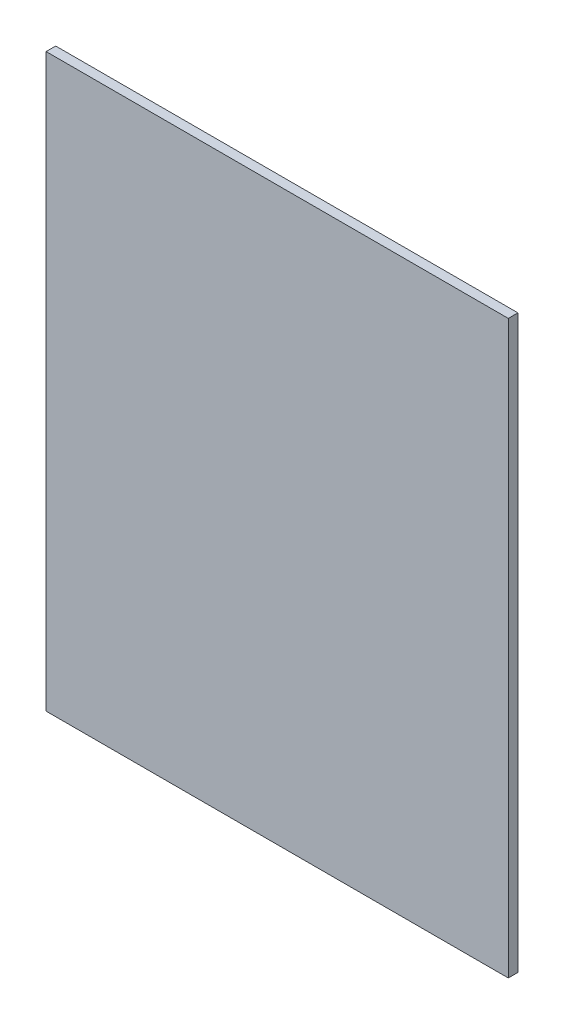
ISO-10303-21;
HEADER;
FILE_DESCRIPTION(('STEP AP214'),'2;1');
FILE_NAME('part.step','',(''),(''),'','','');
FILE_SCHEMA(('AUTOMOTIVE_DESIGN { 1 0 10303 214 1 1 1 1 }'));
ENDSEC;
DATA;
#1=APPLICATION_CONTEXT('core data for automotive mechanical design processes');
#2=APPLICATION_PROTOCOL_DEFINITION('international standard','automotive_design',2000,#1);
#3=PRODUCT_CONTEXT('',#1,'mechanical');
#4=PRODUCT('Part','Part','',(#3));
#5=PRODUCT_RELATED_PRODUCT_CATEGORY('part','',(#4));
#6=PRODUCT_DEFINITION_FORMATION('','',#4);
#7=PRODUCT_DEFINITION_CONTEXT('part definition',#1,'design');
#8=PRODUCT_DEFINITION('design','',#6,#7);
#9=PRODUCT_DEFINITION_SHAPE('','',#8);
#10=(LENGTH_UNIT() NAMED_UNIT(*) SI_UNIT(.MILLI.,.METRE.));
#11=(NAMED_UNIT(*) PLANE_ANGLE_UNIT() SI_UNIT($,.RADIAN.));
#12=(NAMED_UNIT(*) SI_UNIT($,.STERADIAN.) SOLID_ANGLE_UNIT());
#13=UNCERTAINTY_MEASURE_WITH_UNIT(LENGTH_MEASURE(1.E-05),#10,'distance_accuracy_value','');
#14=(GEOMETRIC_REPRESENTATION_CONTEXT(3) GLOBAL_UNCERTAINTY_ASSIGNED_CONTEXT((#13)) GLOBAL_UNIT_ASSIGNED_CONTEXT((#10,
#11,#12)) REPRESENTATION_CONTEXT('',''));
#15=CARTESIAN_POINT('',(0.,0.,0.));
#16=DIRECTION('',(0.,0.,1.));
#17=DIRECTION('',(1.,0.,0.));
#18=AXIS2_PLACEMENT_3D('',#15,#16,#17);
#19=CARTESIAN_POINT('',(438.94375,542.528125,18.25625));
#20=DIRECTION('',(-1.,0.,0.));
#21=DIRECTION('',(0.,-1.,0.));
#22=AXIS2_PLACEMENT_3D('',#19,#20,#21);
#23=PLANE('',#22);
#24=DIRECTION('',(0.,1.,0.));
#25=VECTOR('',#24,1.);
#26=CARTESIAN_POINT('',(438.94375,542.528125,0.));
#27=LINE('',#26,#25);
#28=CARTESIAN_POINT('',(438.94375,-542.528125,0.));
#29=VERTEX_POINT('',#28);
#30=CARTESIAN_POINT('',(438.94375,542.528125,0.));
#31=VERTEX_POINT('',#30);
#32=EDGE_CURVE('E107',#29,#31,#27,.T.);
#33=ORIENTED_EDGE('',*,*,#32,.T.);
#34=DIRECTION('',(0.,0.,-1.));
#35=VECTOR('',#34,1.);
#36=CARTESIAN_POINT('',(438.94375,542.528125,18.25625));
#37=LINE('',#36,#35);
#38=CARTESIAN_POINT('',(438.94375,542.528125,18.25625));
#39=VERTEX_POINT('',#38);
#40=EDGE_CURVE('E11',#39,#31,#37,.T.);
#41=ORIENTED_EDGE('',*,*,#40,.F.);
#42=DIRECTION('',(0.,1.,0.));
#43=VECTOR('',#42,1.);
#44=CARTESIAN_POINT('',(438.94375,542.528125,18.25625));
#45=LINE('',#44,#43);
#46=CARTESIAN_POINT('',(438.94375,-542.528125,18.25625));
#47=VERTEX_POINT('',#46);
#48=EDGE_CURVE('E91',#47,#39,#45,.T.);
#49=ORIENTED_EDGE('',*,*,#48,.F.);
#50=DIRECTION('',(0.,0.,-1.));
#51=VECTOR('',#50,1.);
#52=CARTESIAN_POINT('',(438.94375,-542.528125,18.25625));
#53=LINE('',#52,#51);
#54=EDGE_CURVE('E103',#47,#29,#53,.T.);
#55=ORIENTED_EDGE('',*,*,#54,.T.);
#56=EDGE_LOOP('',(#33,#41,#49,#55));
#57=FACE_BOUND('',#56,.T.);
#58=ADVANCED_FACE('F39',(#57),#23,.F.);
#59=CARTESIAN_POINT('',(-438.94375,542.528125,18.25625));
#60=DIRECTION('',(0.,-1.,0.));
#61=DIRECTION('',(0.,0.,-1.));
#62=AXIS2_PLACEMENT_3D('',#59,#60,#61);
#63=PLANE('',#62);
#64=DIRECTION('',(-1.,0.,0.));
#65=VECTOR('',#64,1.);
#66=CARTESIAN_POINT('',(-438.94375,542.528125,0.));
#67=LINE('',#66,#65);
#68=CARTESIAN_POINT('',(-438.94375,542.528125,0.));
#69=VERTEX_POINT('',#68);
#70=EDGE_CURVE('E96',#31,#69,#67,.T.);
#71=ORIENTED_EDGE('',*,*,#70,.T.);
#72=DIRECTION('',(0.,0.,-1.));
#73=VECTOR('',#72,1.);
#74=CARTESIAN_POINT('',(-438.94375,542.528125,18.25625));
#75=LINE('',#74,#73);
#76=CARTESIAN_POINT('',(-438.94375,542.528125,18.25625));
#77=VERTEX_POINT('',#76);
#78=EDGE_CURVE('E48',#77,#69,#75,.T.);
#79=ORIENTED_EDGE('',*,*,#78,.F.);
#80=DIRECTION('',(-1.,0.,0.));
#81=VECTOR('',#80,1.);
#82=CARTESIAN_POINT('',(-438.94375,542.528125,18.25625));
#83=LINE('',#82,#81);
#84=EDGE_CURVE('E86',#39,#77,#83,.T.);
#85=ORIENTED_EDGE('',*,*,#84,.F.);
#86=ORIENTED_EDGE('',*,*,#40,.T.);
#87=EDGE_LOOP('',(#71,#79,#85,#86));
#88=FACE_BOUND('',#87,.T.);
#89=ADVANCED_FACE('F95',(#88),#63,.F.);
#90=CARTESIAN_POINT('',(-438.94375,542.528125,18.25625));
#91=DIRECTION('',(1.,0.,0.));
#92=DIRECTION('',(0.,1.,0.));
#93=AXIS2_PLACEMENT_3D('',#90,#91,#92);
#94=PLANE('',#93);
#95=DIRECTION('',(0.,-1.,0.));
#96=VECTOR('',#95,1.);
#97=CARTESIAN_POINT('',(-438.94375,542.528125,0.));
#98=LINE('',#97,#96);
#99=CARTESIAN_POINT('',(-438.94375,-542.528125,0.));
#100=VERTEX_POINT('',#99);
#101=EDGE_CURVE('E73',#69,#100,#98,.T.);
#102=ORIENTED_EDGE('',*,*,#101,.T.);
#103=DIRECTION('',(0.,0.,-1.));
#104=VECTOR('',#103,1.);
#105=CARTESIAN_POINT('',(-438.94375,-542.528125,18.25625));
#106=LINE('',#105,#104);
#107=CARTESIAN_POINT('',(-438.94375,-542.528125,18.25625));
#108=VERTEX_POINT('',#107);
#109=EDGE_CURVE('E98',#108,#100,#106,.T.);
#110=ORIENTED_EDGE('',*,*,#109,.F.);
#111=DIRECTION('',(0.,-1.,0.));
#112=VECTOR('',#111,1.);
#113=CARTESIAN_POINT('',(-438.94375,542.528125,18.25625));
#114=LINE('',#113,#112);
#115=EDGE_CURVE('E89',#77,#108,#114,.T.);
#116=ORIENTED_EDGE('',*,*,#115,.F.);
#117=ORIENTED_EDGE('',*,*,#78,.T.);
#118=EDGE_LOOP('',(#102,#110,#116,#117));
#119=FACE_BOUND('',#118,.T.);
#120=ADVANCED_FACE('F99',(#119),#94,.F.);
#121=CARTESIAN_POINT('',(-438.94375,-542.528125,18.25625));
#122=DIRECTION('',(0.,1.,0.));
#123=DIRECTION('',(0.,0.,1.));
#124=AXIS2_PLACEMENT_3D('',#121,#122,#123);
#125=PLANE('',#124);
#126=DIRECTION('',(1.,0.,0.));
#127=VECTOR('',#126,1.);
#128=CARTESIAN_POINT('',(-438.94375,-542.528125,0.));
#129=LINE('',#128,#127);
#130=EDGE_CURVE('E79',#100,#29,#129,.T.);
#131=ORIENTED_EDGE('',*,*,#130,.T.);
#132=ORIENTED_EDGE('',*,*,#54,.F.);
#133=DIRECTION('',(1.,0.,0.));
#134=VECTOR('',#133,1.);
#135=CARTESIAN_POINT('',(-438.94375,-542.528125,18.25625));
#136=LINE('',#135,#134);
#137=EDGE_CURVE('E56',#108,#47,#136,.T.);
#138=ORIENTED_EDGE('',*,*,#137,.F.);
#139=ORIENTED_EDGE('',*,*,#109,.T.);
#140=EDGE_LOOP('',(#131,#132,#138,#139));
#141=FACE_BOUND('',#140,.T.);
#142=ADVANCED_FACE('F120',(#141),#125,.F.);
#143=CARTESIAN_POINT('',(0.,0.,18.25625));
#144=DIRECTION('',(0.,0.,1.));
#145=DIRECTION('',(1.,0.,0.));
#146=AXIS2_PLACEMENT_3D('',#143,#144,#145);
#147=PLANE('',#146);
#148=ORIENTED_EDGE('',*,*,#48,.T.);
#149=ORIENTED_EDGE('',*,*,#84,.T.);
#150=ORIENTED_EDGE('',*,*,#115,.T.);
#151=ORIENTED_EDGE('',*,*,#137,.T.);
#152=EDGE_LOOP('',(#148,#149,#150,#151));
#153=FACE_BOUND('',#152,.T.);
#154=ADVANCED_FACE('F87',(#153),#147,.T.);
#155=CARTESIAN_POINT('',(0.,0.,0.));
#156=DIRECTION('',(0.,0.,1.));
#157=DIRECTION('',(1.,0.,0.));
#158=AXIS2_PLACEMENT_3D('',#155,#156,#157);
#159=PLANE('',#158);
#160=ORIENTED_EDGE('',*,*,#32,.F.);
#161=ORIENTED_EDGE('',*,*,#130,.F.);
#162=ORIENTED_EDGE('',*,*,#101,.F.);
#163=ORIENTED_EDGE('',*,*,#70,.F.);
#164=EDGE_LOOP('',(#160,#161,#162,#163));
#165=FACE_BOUND('',#164,.T.);
#166=ADVANCED_FACE('F123',(#165),#159,.F.);
#167=CLOSED_SHELL('',(#58,#89,#120,#142,#154,#166));
#168=MANIFOLD_SOLID_BREP('B2',#167);
#169=ADVANCED_BREP_SHAPE_REPRESENTATION('',(#18,#168),#14);
#170=SHAPE_DEFINITION_REPRESENTATION(#9,#169);
ENDSEC;
END-ISO-10303-21;
